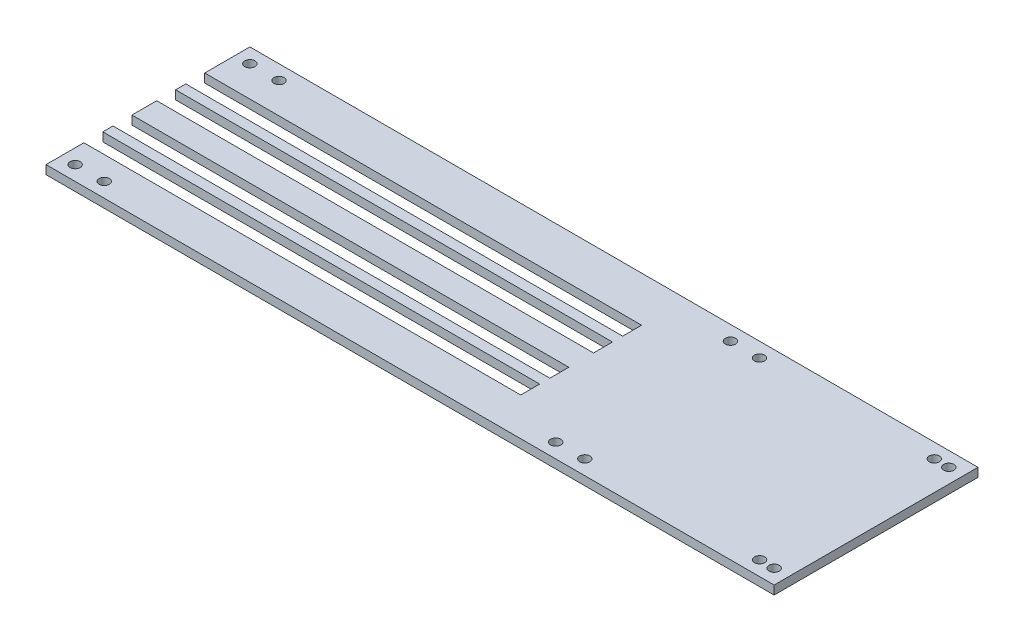
ISO-10303-21;
HEADER;
FILE_DESCRIPTION(('STEP AP214'),'2;1');
FILE_NAME('part.step','',(''),(''),'','','');
FILE_SCHEMA(('AUTOMOTIVE_DESIGN { 1 0 10303 214 1 1 1 1 }'));
ENDSEC;
DATA;
#1=APPLICATION_CONTEXT('core data for automotive mechanical design processes');
#2=APPLICATION_PROTOCOL_DEFINITION('international standard','automotive_design',2000,#1);
#3=PRODUCT_CONTEXT('',#1,'mechanical');
#4=PRODUCT('Part','Part','',(#3));
#5=PRODUCT_RELATED_PRODUCT_CATEGORY('part','',(#4));
#6=PRODUCT_DEFINITION_FORMATION('','',#4);
#7=PRODUCT_DEFINITION_CONTEXT('part definition',#1,'design');
#8=PRODUCT_DEFINITION('design','',#6,#7);
#9=PRODUCT_DEFINITION_SHAPE('','',#8);
#10=(LENGTH_UNIT() NAMED_UNIT(*) SI_UNIT(.MILLI.,.METRE.));
#11=(NAMED_UNIT(*) PLANE_ANGLE_UNIT() SI_UNIT($,.RADIAN.));
#12=(NAMED_UNIT(*) SI_UNIT($,.STERADIAN.) SOLID_ANGLE_UNIT());
#13=UNCERTAINTY_MEASURE_WITH_UNIT(LENGTH_MEASURE(1.E-05),#10,'distance_accuracy_value','');
#14=(GEOMETRIC_REPRESENTATION_CONTEXT(3) GLOBAL_UNCERTAINTY_ASSIGNED_CONTEXT((#13)) GLOBAL_UNIT_ASSIGNED_CONTEXT((#10,
#11,#12)) REPRESENTATION_CONTEXT('',''));
#15=CARTESIAN_POINT('',(0.,0.,0.));
#16=DIRECTION('',(0.,0.,1.));
#17=DIRECTION('',(1.,0.,0.));
#18=AXIS2_PLACEMENT_3D('',#15,#16,#17);
#19=CARTESIAN_POINT('',(0.,3.,0.));
#20=DIRECTION('',(0.,0.,-1.));
#21=DIRECTION('',(-1.,0.,0.));
#22=AXIS2_PLACEMENT_3D('',#19,#20,#21);
#23=PLANE('',#22);
#24=DIRECTION('',(1.,0.,0.));
#25=VECTOR('',#24,1.);
#26=CARTESIAN_POINT('',(0.,0.,0.));
#27=LINE('',#26,#25);
#28=CARTESIAN_POINT('',(-150.,0.,0.));
#29=VERTEX_POINT('',#28);
#30=CARTESIAN_POINT('',(100.,0.,0.));
#31=VERTEX_POINT('',#30);
#32=EDGE_CURVE('E141',#29,#31,#27,.T.);
#33=ORIENTED_EDGE('',*,*,#32,.T.);
#34=DIRECTION('',(0.,-1.,0.));
#35=VECTOR('',#34,1.);
#36=CARTESIAN_POINT('',(100.,3.,0.));
#37=LINE('',#36,#35);
#38=CARTESIAN_POINT('',(100.,3.,0.));
#39=VERTEX_POINT('',#38);
#40=EDGE_CURVE('E12',#39,#31,#37,.T.);
#41=ORIENTED_EDGE('',*,*,#40,.F.);
#42=DIRECTION('',(1.,0.,0.));
#43=VECTOR('',#42,1.);
#44=CARTESIAN_POINT('',(-150.,3.,0.));
#45=LINE('',#44,#43);
#46=CARTESIAN_POINT('',(-150.,3.,0.));
#47=VERTEX_POINT('',#46);
#48=EDGE_CURVE('E147',#47,#39,#45,.T.);
#49=ORIENTED_EDGE('',*,*,#48,.F.);
#50=DIRECTION('',(0.,-1.,0.));
#51=VECTOR('',#50,1.);
#52=CARTESIAN_POINT('',(-150.,3.,0.));
#53=LINE('',#52,#51);
#54=EDGE_CURVE('E221',#47,#29,#53,.T.);
#55=ORIENTED_EDGE('',*,*,#54,.T.);
#56=EDGE_LOOP('',(#33,#41,#49,#55));
#57=FACE_BOUND('',#56,.T.);
#58=ADVANCED_FACE('F50',(#57),#23,.F.);
#59=CARTESIAN_POINT('',(100.,3.,0.));
#60=DIRECTION('',(-1.,0.,0.));
#61=DIRECTION('',(0.,0.,1.));
#62=AXIS2_PLACEMENT_3D('',#59,#60,#61);
#63=PLANE('',#62);
#64=DIRECTION('',(0.,0.,-1.));
#65=VECTOR('',#64,1.);
#66=CARTESIAN_POINT('',(100.,0.,0.));
#67=LINE('',#66,#65);
#68=CARTESIAN_POINT('',(100.,0.,-70.));
#69=VERTEX_POINT('',#68);
#70=EDGE_CURVE('E482',#31,#69,#67,.T.);
#71=ORIENTED_EDGE('',*,*,#70,.T.);
#72=DIRECTION('',(0.,-1.,0.));
#73=VECTOR('',#72,1.);
#74=CARTESIAN_POINT('',(100.,3.,-70.));
#75=LINE('',#74,#73);
#76=CARTESIAN_POINT('',(100.,3.,-70.));
#77=VERTEX_POINT('',#76);
#78=EDGE_CURVE('E60',#77,#69,#75,.T.);
#79=ORIENTED_EDGE('',*,*,#78,.F.);
#80=DIRECTION('',(0.,0.,-1.));
#81=VECTOR('',#80,1.);
#82=CARTESIAN_POINT('',(100.,3.,0.));
#83=LINE('',#82,#81);
#84=EDGE_CURVE('E299',#39,#77,#83,.T.);
#85=ORIENTED_EDGE('',*,*,#84,.F.);
#86=ORIENTED_EDGE('',*,*,#40,.T.);
#87=EDGE_LOOP('',(#71,#79,#85,#86));
#88=FACE_BOUND('',#87,.T.);
#89=ADVANCED_FACE('F472',(#88),#63,.F.);
#90=CARTESIAN_POINT('',(-150.,3.,-70.));
#91=DIRECTION('',(0.,0.,1.));
#92=DIRECTION('',(1.,0.,0.));
#93=AXIS2_PLACEMENT_3D('',#90,#91,#92);
#94=PLANE('',#93);
#95=DIRECTION('',(-1.,0.,0.));
#96=VECTOR('',#95,1.);
#97=CARTESIAN_POINT('',(-150.,0.,-70.));
#98=LINE('',#97,#96);
#99=CARTESIAN_POINT('',(-150.,0.,-70.));
#100=VERTEX_POINT('',#99);
#101=EDGE_CURVE('E487',#69,#100,#98,.T.);
#102=ORIENTED_EDGE('',*,*,#101,.T.);
#103=DIRECTION('',(0.,-1.,0.));
#104=VECTOR('',#103,1.);
#105=CARTESIAN_POINT('',(-150.,3.,-70.));
#106=LINE('',#105,#104);
#107=CARTESIAN_POINT('',(-150.,3.,-70.));
#108=VERTEX_POINT('',#107);
#109=EDGE_CURVE('E599',#108,#100,#106,.T.);
#110=ORIENTED_EDGE('',*,*,#109,.F.);
#111=DIRECTION('',(-1.,0.,0.));
#112=VECTOR('',#111,1.);
#113=CARTESIAN_POINT('',(-50.,3.,-70.));
#114=LINE('',#113,#112);
#115=EDGE_CURVE('E295',#77,#108,#114,.T.);
#116=ORIENTED_EDGE('',*,*,#115,.F.);
#117=ORIENTED_EDGE('',*,*,#78,.T.);
#118=EDGE_LOOP('',(#102,#110,#116,#117));
#119=FACE_BOUND('',#118,.T.);
#120=ADVANCED_FACE('F477',(#119),#94,.F.);
#121=CARTESIAN_POINT('',(-150.,3.,-54.5));
#122=DIRECTION('',(1.,0.,0.));
#123=DIRECTION('',(0.,0.,-1.));
#124=AXIS2_PLACEMENT_3D('',#121,#122,#123);
#125=PLANE('',#124);
#126=DIRECTION('',(0.,0.,1.));
#127=VECTOR('',#126,1.);
#128=CARTESIAN_POINT('',(-150.,0.,-54.5));
#129=LINE('',#128,#127);
#130=CARTESIAN_POINT('',(-150.,0.,-54.5));
#131=VERTEX_POINT('',#130);
#132=EDGE_CURVE('E491',#100,#131,#129,.T.);
#133=ORIENTED_EDGE('',*,*,#132,.T.);
#134=DIRECTION('',(0.,-1.,0.));
#135=VECTOR('',#134,1.);
#136=CARTESIAN_POINT('',(-150.,3.,-54.5));
#137=LINE('',#136,#135);
#138=CARTESIAN_POINT('',(-150.,3.,-54.5));
#139=VERTEX_POINT('',#138);
#140=EDGE_CURVE('E595',#139,#131,#137,.T.);
#141=ORIENTED_EDGE('',*,*,#140,.F.);
#142=DIRECTION('',(0.,0.,1.));
#143=VECTOR('',#142,1.);
#144=CARTESIAN_POINT('',(-150.,3.,-54.5));
#145=LINE('',#144,#143);
#146=EDGE_CURVE('E291',#108,#139,#145,.T.);
#147=ORIENTED_EDGE('',*,*,#146,.F.);
#148=ORIENTED_EDGE('',*,*,#109,.T.);
#149=EDGE_LOOP('',(#133,#141,#147,#148));
#150=FACE_BOUND('',#149,.T.);
#151=ADVANCED_FACE('F689',(#150),#125,.F.);
#152=CARTESIAN_POINT('',(0.,3.,-54.5));
#153=DIRECTION('',(0.,0.,-1.));
#154=DIRECTION('',(-1.,0.,0.));
#155=AXIS2_PLACEMENT_3D('',#152,#153,#154);
#156=PLANE('',#155);
#157=DIRECTION('',(1.,0.,0.));
#158=VECTOR('',#157,1.);
#159=CARTESIAN_POINT('',(0.,0.,-54.5));
#160=LINE('',#159,#158);
#161=CARTESIAN_POINT('',(0.,0.,-54.5));
#162=VERTEX_POINT('',#161);
#163=EDGE_CURVE('E496',#131,#162,#160,.T.);
#164=ORIENTED_EDGE('',*,*,#163,.T.);
#165=DIRECTION('',(0.,-1.,0.));
#166=VECTOR('',#165,1.);
#167=CARTESIAN_POINT('',(0.,3.,-54.5));
#168=LINE('',#167,#166);
#169=CARTESIAN_POINT('',(0.,3.,-54.5));
#170=VERTEX_POINT('',#169);
#171=EDGE_CURVE('E591',#170,#162,#168,.T.);
#172=ORIENTED_EDGE('',*,*,#171,.F.);
#173=DIRECTION('',(1.,0.,0.));
#174=VECTOR('',#173,1.);
#175=CARTESIAN_POINT('',(0.,3.,-54.5));
#176=LINE('',#175,#174);
#177=EDGE_CURVE('E288',#139,#170,#176,.T.);
#178=ORIENTED_EDGE('',*,*,#177,.F.);
#179=ORIENTED_EDGE('',*,*,#140,.T.);
#180=EDGE_LOOP('',(#164,#172,#178,#179));
#181=FACE_BOUND('',#180,.T.);
#182=ADVANCED_FACE('F685',(#181),#156,.F.);
#183=CARTESIAN_POINT('',(0.,3.,-48.));
#184=DIRECTION('',(1.,0.,0.));
#185=DIRECTION('',(0.,0.,-1.));
#186=AXIS2_PLACEMENT_3D('',#183,#184,#185);
#187=PLANE('',#186);
#188=DIRECTION('',(0.,0.,1.));
#189=VECTOR('',#188,1.);
#190=CARTESIAN_POINT('',(0.,0.,-48.));
#191=LINE('',#190,#189);
#192=CARTESIAN_POINT('',(0.,0.,-48.));
#193=VERTEX_POINT('',#192);
#194=EDGE_CURVE('E499',#162,#193,#191,.T.);
#195=ORIENTED_EDGE('',*,*,#194,.T.);
#196=DIRECTION('',(0.,-1.,0.));
#197=VECTOR('',#196,1.);
#198=CARTESIAN_POINT('',(0.,3.,-48.));
#199=LINE('',#198,#197);
#200=CARTESIAN_POINT('',(0.,3.,-48.));
#201=VERTEX_POINT('',#200);
#202=EDGE_CURVE('E587',#201,#193,#199,.T.);
#203=ORIENTED_EDGE('',*,*,#202,.F.);
#204=DIRECTION('',(0.,0.,1.));
#205=VECTOR('',#204,1.);
#206=CARTESIAN_POINT('',(0.,3.,-48.));
#207=LINE('',#206,#205);
#208=EDGE_CURVE('E280',#170,#201,#207,.T.);
#209=ORIENTED_EDGE('',*,*,#208,.F.);
#210=ORIENTED_EDGE('',*,*,#171,.T.);
#211=EDGE_LOOP('',(#195,#203,#209,#210));
#212=FACE_BOUND('',#211,.T.);
#213=ADVANCED_FACE('F681',(#212),#187,.F.);
#214=CARTESIAN_POINT('',(-150.,3.,-48.));
#215=DIRECTION('',(0.,0.,1.));
#216=DIRECTION('',(1.,0.,0.));
#217=AXIS2_PLACEMENT_3D('',#214,#215,#216);
#218=PLANE('',#217);
#219=DIRECTION('',(-1.,0.,0.));
#220=VECTOR('',#219,1.);
#221=CARTESIAN_POINT('',(-150.,0.,-48.));
#222=LINE('',#221,#220);
#223=CARTESIAN_POINT('',(-150.,0.,-48.));
#224=VERTEX_POINT('',#223);
#225=EDGE_CURVE('E502',#193,#224,#222,.T.);
#226=ORIENTED_EDGE('',*,*,#225,.T.);
#227=DIRECTION('',(0.,-1.,0.));
#228=VECTOR('',#227,1.);
#229=CARTESIAN_POINT('',(-150.,3.,-48.));
#230=LINE('',#229,#228);
#231=CARTESIAN_POINT('',(-150.,3.,-48.));
#232=VERTEX_POINT('',#231);
#233=EDGE_CURVE('E583',#232,#224,#230,.T.);
#234=ORIENTED_EDGE('',*,*,#233,.F.);
#235=DIRECTION('',(-1.,0.,0.));
#236=VECTOR('',#235,1.);
#237=CARTESIAN_POINT('',(-150.,3.,-48.));
#238=LINE('',#237,#236);
#239=EDGE_CURVE('E276',#201,#232,#238,.T.);
#240=ORIENTED_EDGE('',*,*,#239,.F.);
#241=ORIENTED_EDGE('',*,*,#202,.T.);
#242=EDGE_LOOP('',(#226,#234,#240,#241));
#243=FACE_BOUND('',#242,.T.);
#244=ADVANCED_FACE('F677',(#243),#218,.F.);
#245=CARTESIAN_POINT('',(-150.,3.,-44.5));
#246=DIRECTION('',(1.,0.,0.));
#247=DIRECTION('',(0.,0.,-1.));
#248=AXIS2_PLACEMENT_3D('',#245,#246,#247);
#249=PLANE('',#248);
#250=DIRECTION('',(0.,0.,1.));
#251=VECTOR('',#250,1.);
#252=CARTESIAN_POINT('',(-150.,0.,-44.5));
#253=LINE('',#252,#251);
#254=CARTESIAN_POINT('',(-150.,0.,-44.5));
#255=VERTEX_POINT('',#254);
#256=EDGE_CURVE('E505',#224,#255,#253,.T.);
#257=ORIENTED_EDGE('',*,*,#256,.T.);
#258=DIRECTION('',(0.,-1.,0.));
#259=VECTOR('',#258,1.);
#260=CARTESIAN_POINT('',(-150.,3.,-44.5));
#261=LINE('',#260,#259);
#262=CARTESIAN_POINT('',(-150.,3.,-44.5));
#263=VERTEX_POINT('',#262);
#264=EDGE_CURVE('E579',#263,#255,#261,.T.);
#265=ORIENTED_EDGE('',*,*,#264,.F.);
#266=DIRECTION('',(0.,0.,1.));
#267=VECTOR('',#266,1.);
#268=CARTESIAN_POINT('',(-150.,3.,-44.5));
#269=LINE('',#268,#267);
#270=EDGE_CURVE('E272',#232,#263,#269,.T.);
#271=ORIENTED_EDGE('',*,*,#270,.F.);
#272=ORIENTED_EDGE('',*,*,#233,.T.);
#273=EDGE_LOOP('',(#257,#265,#271,#272));
#274=FACE_BOUND('',#273,.T.);
#275=ADVANCED_FACE('F673',(#274),#249,.F.);
#276=CARTESIAN_POINT('',(0.,3.,-44.5));
#277=DIRECTION('',(0.,0.,-1.));
#278=DIRECTION('',(-1.,0.,0.));
#279=AXIS2_PLACEMENT_3D('',#276,#277,#278);
#280=PLANE('',#279);
#281=DIRECTION('',(1.,0.,0.));
#282=VECTOR('',#281,1.);
#283=CARTESIAN_POINT('',(0.,0.,-44.5));
#284=LINE('',#283,#282);
#285=CARTESIAN_POINT('',(0.,0.,-44.5));
#286=VERTEX_POINT('',#285);
#287=EDGE_CURVE('E508',#255,#286,#284,.T.);
#288=ORIENTED_EDGE('',*,*,#287,.T.);
#289=DIRECTION('',(0.,-1.,0.));
#290=VECTOR('',#289,1.);
#291=CARTESIAN_POINT('',(0.,3.,-44.5));
#292=LINE('',#291,#290);
#293=CARTESIAN_POINT('',(0.,3.,-44.5));
#294=VERTEX_POINT('',#293);
#295=EDGE_CURVE('E575',#294,#286,#292,.T.);
#296=ORIENTED_EDGE('',*,*,#295,.F.);
#297=DIRECTION('',(1.,0.,0.));
#298=VECTOR('',#297,1.);
#299=CARTESIAN_POINT('',(0.,3.,-44.5));
#300=LINE('',#299,#298);
#301=EDGE_CURVE('E269',#263,#294,#300,.T.);
#302=ORIENTED_EDGE('',*,*,#301,.F.);
#303=ORIENTED_EDGE('',*,*,#264,.T.);
#304=EDGE_LOOP('',(#288,#296,#302,#303));
#305=FACE_BOUND('',#304,.T.);
#306=ADVANCED_FACE('F669',(#305),#280,.F.);
#307=CARTESIAN_POINT('',(0.,3.,-38.));
#308=DIRECTION('',(1.,0.,0.));
#309=DIRECTION('',(0.,0.,-1.));
#310=AXIS2_PLACEMENT_3D('',#307,#308,#309);
#311=PLANE('',#310);
#312=DIRECTION('',(0.,0.,1.));
#313=VECTOR('',#312,1.);
#314=CARTESIAN_POINT('',(0.,0.,-38.));
#315=LINE('',#314,#313);
#316=CARTESIAN_POINT('',(0.,0.,-38.));
#317=VERTEX_POINT('',#316);
#318=EDGE_CURVE('E511',#286,#317,#315,.T.);
#319=ORIENTED_EDGE('',*,*,#318,.T.);
#320=DIRECTION('',(0.,-1.,0.));
#321=VECTOR('',#320,1.);
#322=CARTESIAN_POINT('',(0.,3.,-38.));
#323=LINE('',#322,#321);
#324=CARTESIAN_POINT('',(0.,3.,-38.));
#325=VERTEX_POINT('',#324);
#326=EDGE_CURVE('E571',#325,#317,#323,.T.);
#327=ORIENTED_EDGE('',*,*,#326,.F.);
#328=DIRECTION('',(0.,0.,1.));
#329=VECTOR('',#328,1.);
#330=CARTESIAN_POINT('',(0.,3.,-38.));
#331=LINE('',#330,#329);
#332=EDGE_CURVE('E261',#294,#325,#331,.T.);
#333=ORIENTED_EDGE('',*,*,#332,.F.);
#334=ORIENTED_EDGE('',*,*,#295,.T.);
#335=EDGE_LOOP('',(#319,#327,#333,#334));
#336=FACE_BOUND('',#335,.T.);
#337=ADVANCED_FACE('F665',(#336),#311,.F.);
#338=CARTESIAN_POINT('',(-150.,3.,-38.));
#339=DIRECTION('',(0.,0.,1.));
#340=DIRECTION('',(1.,0.,0.));
#341=AXIS2_PLACEMENT_3D('',#338,#339,#340);
#342=PLANE('',#341);
#343=DIRECTION('',(-1.,0.,0.));
#344=VECTOR('',#343,1.);
#345=CARTESIAN_POINT('',(-150.,0.,-38.));
#346=LINE('',#345,#344);
#347=CARTESIAN_POINT('',(-150.,0.,-38.));
#348=VERTEX_POINT('',#347);
#349=EDGE_CURVE('E514',#317,#348,#346,.T.);
#350=ORIENTED_EDGE('',*,*,#349,.T.);
#351=DIRECTION('',(0.,-1.,0.));
#352=VECTOR('',#351,1.);
#353=CARTESIAN_POINT('',(-150.,3.,-38.));
#354=LINE('',#353,#352);
#355=CARTESIAN_POINT('',(-150.,3.,-38.));
#356=VERTEX_POINT('',#355);
#357=EDGE_CURVE('E567',#356,#348,#354,.T.);
#358=ORIENTED_EDGE('',*,*,#357,.F.);
#359=DIRECTION('',(-1.,0.,0.));
#360=VECTOR('',#359,1.);
#361=CARTESIAN_POINT('',(-150.,3.,-38.));
#362=LINE('',#361,#360);
#363=EDGE_CURVE('E257',#325,#356,#362,.T.);
#364=ORIENTED_EDGE('',*,*,#363,.F.);
#365=ORIENTED_EDGE('',*,*,#326,.T.);
#366=EDGE_LOOP('',(#350,#358,#364,#365));
#367=FACE_BOUND('',#366,.T.);
#368=ADVANCED_FACE('F661',(#367),#342,.F.);
#369=CARTESIAN_POINT('',(-150.,3.,-29.5));
#370=DIRECTION('',(1.,0.,0.));
#371=DIRECTION('',(0.,0.,-1.));
#372=AXIS2_PLACEMENT_3D('',#369,#370,#371);
#373=PLANE('',#372);
#374=DIRECTION('',(0.,0.,1.));
#375=VECTOR('',#374,1.);
#376=CARTESIAN_POINT('',(-150.,0.,-29.5));
#377=LINE('',#376,#375);
#378=CARTESIAN_POINT('',(-150.,0.,-29.5));
#379=VERTEX_POINT('',#378);
#380=EDGE_CURVE('E517',#348,#379,#377,.T.);
#381=ORIENTED_EDGE('',*,*,#380,.T.);
#382=DIRECTION('',(0.,-1.,0.));
#383=VECTOR('',#382,1.);
#384=CARTESIAN_POINT('',(-150.,3.,-29.5));
#385=LINE('',#384,#383);
#386=CARTESIAN_POINT('',(-150.,3.,-29.5));
#387=VERTEX_POINT('',#386);
#388=EDGE_CURVE('E563',#387,#379,#385,.T.);
#389=ORIENTED_EDGE('',*,*,#388,.F.);
#390=DIRECTION('',(0.,0.,1.));
#391=VECTOR('',#390,1.);
#392=CARTESIAN_POINT('',(-150.,3.,-29.5));
#393=LINE('',#392,#391);
#394=EDGE_CURVE('E253',#356,#387,#393,.T.);
#395=ORIENTED_EDGE('',*,*,#394,.F.);
#396=ORIENTED_EDGE('',*,*,#357,.T.);
#397=EDGE_LOOP('',(#381,#389,#395,#396));
#398=FACE_BOUND('',#397,.T.);
#399=ADVANCED_FACE('F657',(#398),#373,.F.);
#400=CARTESIAN_POINT('',(-150.,3.,-29.5));
#401=DIRECTION('',(0.,0.,-1.));
#402=DIRECTION('',(-1.,0.,0.));
#403=AXIS2_PLACEMENT_3D('',#400,#401,#402);
#404=PLANE('',#403);
#405=DIRECTION('',(1.,0.,0.));
#406=VECTOR('',#405,1.);
#407=CARTESIAN_POINT('',(-150.,0.,-29.5));
#408=LINE('',#407,#406);
#409=CARTESIAN_POINT('',(0.,0.,-29.5));
#410=VERTEX_POINT('',#409);
#411=EDGE_CURVE('E520',#379,#410,#408,.T.);
#412=ORIENTED_EDGE('',*,*,#411,.T.);
#413=DIRECTION('',(0.,-1.,0.));
#414=VECTOR('',#413,1.);
#415=CARTESIAN_POINT('',(0.,3.,-29.5));
#416=LINE('',#415,#414);
#417=CARTESIAN_POINT('',(0.,3.,-29.5));
#418=VERTEX_POINT('',#417);
#419=EDGE_CURVE('E559',#418,#410,#416,.T.);
#420=ORIENTED_EDGE('',*,*,#419,.F.);
#421=DIRECTION('',(1.,0.,0.));
#422=VECTOR('',#421,1.);
#423=CARTESIAN_POINT('',(-150.,3.,-29.5));
#424=LINE('',#423,#422);
#425=EDGE_CURVE('E250',#387,#418,#424,.T.);
#426=ORIENTED_EDGE('',*,*,#425,.F.);
#427=ORIENTED_EDGE('',*,*,#388,.T.);
#428=EDGE_LOOP('',(#412,#420,#426,#427));
#429=FACE_BOUND('',#428,.T.);
#430=ADVANCED_FACE('F654',(#429),#404,.F.);
#431=CARTESIAN_POINT('',(0.,3.,-29.5));
#432=DIRECTION('',(1.,0.,0.));
#433=DIRECTION('',(0.,0.,-1.));
#434=AXIS2_PLACEMENT_3D('',#431,#432,#433);
#435=PLANE('',#434);
#436=DIRECTION('',(0.,0.,1.));
#437=VECTOR('',#436,1.);
#438=CARTESIAN_POINT('',(0.,0.,-29.5));
#439=LINE('',#438,#437);
#440=CARTESIAN_POINT('',(0.,0.,-23.));
#441=VERTEX_POINT('',#440);
#442=EDGE_CURVE('E523',#410,#441,#439,.T.);
#443=ORIENTED_EDGE('',*,*,#442,.T.);
#444=DIRECTION('',(0.,-1.,0.));
#445=VECTOR('',#444,1.);
#446=CARTESIAN_POINT('',(0.,3.,-23.));
#447=LINE('',#446,#445);
#448=CARTESIAN_POINT('',(0.,3.,-23.));
#449=VERTEX_POINT('',#448);
#450=EDGE_CURVE('E555',#449,#441,#447,.T.);
#451=ORIENTED_EDGE('',*,*,#450,.F.);
#452=DIRECTION('',(0.,0.,1.));
#453=VECTOR('',#452,1.);
#454=CARTESIAN_POINT('',(0.,3.,-29.5));
#455=LINE('',#454,#453);
#456=EDGE_CURVE('E242',#418,#449,#455,.T.);
#457=ORIENTED_EDGE('',*,*,#456,.F.);
#458=ORIENTED_EDGE('',*,*,#419,.T.);
#459=EDGE_LOOP('',(#443,#451,#457,#458));
#460=FACE_BOUND('',#459,.T.);
#461=ADVANCED_FACE('F619',(#460),#435,.F.);
#462=CARTESIAN_POINT('',(0.,3.,-23.));
#463=DIRECTION('',(0.,0.,1.));
#464=DIRECTION('',(1.,0.,0.));
#465=AXIS2_PLACEMENT_3D('',#462,#463,#464);
#466=PLANE('',#465);
#467=DIRECTION('',(-1.,0.,0.));
#468=VECTOR('',#467,1.);
#469=CARTESIAN_POINT('',(0.,0.,-23.));
#470=LINE('',#469,#468);
#471=CARTESIAN_POINT('',(-150.,0.,-23.));
#472=VERTEX_POINT('',#471);
#473=EDGE_CURVE('E526',#441,#472,#470,.T.);
#474=ORIENTED_EDGE('',*,*,#473,.T.);
#475=DIRECTION('',(0.,-1.,0.));
#476=VECTOR('',#475,1.);
#477=CARTESIAN_POINT('',(-150.,3.,-23.));
#478=LINE('',#477,#476);
#479=CARTESIAN_POINT('',(-150.,3.,-23.));
#480=VERTEX_POINT('',#479);
#481=EDGE_CURVE('E551',#480,#472,#478,.T.);
#482=ORIENTED_EDGE('',*,*,#481,.F.);
#483=DIRECTION('',(-1.,0.,0.));
#484=VECTOR('',#483,1.);
#485=CARTESIAN_POINT('',(0.,3.,-23.));
#486=LINE('',#485,#484);
#487=EDGE_CURVE('E238',#449,#480,#486,.T.);
#488=ORIENTED_EDGE('',*,*,#487,.F.);
#489=ORIENTED_EDGE('',*,*,#450,.T.);
#490=EDGE_LOOP('',(#474,#482,#488,#489));
#491=FACE_BOUND('',#490,.T.);
#492=ADVANCED_FACE('F623',(#491),#466,.F.);
#493=CARTESIAN_POINT('',(-150.,3.,-23.));
#494=DIRECTION('',(1.,0.,0.));
#495=DIRECTION('',(0.,0.,-1.));
#496=AXIS2_PLACEMENT_3D('',#493,#494,#495);
#497=PLANE('',#496);
#498=DIRECTION('',(0.,0.,1.));
#499=VECTOR('',#498,1.);
#500=CARTESIAN_POINT('',(-150.,0.,-23.));
#501=LINE('',#500,#499);
#502=CARTESIAN_POINT('',(-150.,0.,-19.5));
#503=VERTEX_POINT('',#502);
#504=EDGE_CURVE('E529',#472,#503,#501,.T.);
#505=ORIENTED_EDGE('',*,*,#504,.T.);
#506=DIRECTION('',(0.,-1.,0.));
#507=VECTOR('',#506,1.);
#508=CARTESIAN_POINT('',(-150.,3.,-19.5));
#509=LINE('',#508,#507);
#510=CARTESIAN_POINT('',(-150.,3.,-19.5));
#511=VERTEX_POINT('',#510);
#512=EDGE_CURVE('E547',#511,#503,#509,.T.);
#513=ORIENTED_EDGE('',*,*,#512,.F.);
#514=DIRECTION('',(0.,0.,1.));
#515=VECTOR('',#514,1.);
#516=CARTESIAN_POINT('',(-150.,3.,-23.));
#517=LINE('',#516,#515);
#518=EDGE_CURVE('E234',#480,#511,#517,.T.);
#519=ORIENTED_EDGE('',*,*,#518,.F.);
#520=ORIENTED_EDGE('',*,*,#481,.T.);
#521=EDGE_LOOP('',(#505,#513,#519,#520));
#522=FACE_BOUND('',#521,.T.);
#523=ADVANCED_FACE('F628',(#522),#497,.F.);
#524=CARTESIAN_POINT('',(-150.,3.,-19.5));
#525=DIRECTION('',(0.,0.,-1.));
#526=DIRECTION('',(-1.,0.,0.));
#527=AXIS2_PLACEMENT_3D('',#524,#525,#526);
#528=PLANE('',#527);
#529=DIRECTION('',(1.,0.,0.));
#530=VECTOR('',#529,1.);
#531=CARTESIAN_POINT('',(-150.,0.,-19.5));
#532=LINE('',#531,#530);
#533=CARTESIAN_POINT('',(0.,0.,-19.5));
#534=VERTEX_POINT('',#533);
#535=EDGE_CURVE('E532',#503,#534,#532,.T.);
#536=ORIENTED_EDGE('',*,*,#535,.T.);
#537=DIRECTION('',(0.,-1.,0.));
#538=VECTOR('',#537,1.);
#539=CARTESIAN_POINT('',(0.,3.,-19.5));
#540=LINE('',#539,#538);
#541=CARTESIAN_POINT('',(0.,3.,-19.5));
#542=VERTEX_POINT('',#541);
#543=EDGE_CURVE('E214',#542,#534,#540,.T.);
#544=ORIENTED_EDGE('',*,*,#543,.F.);
#545=DIRECTION('',(1.,0.,0.));
#546=VECTOR('',#545,1.);
#547=CARTESIAN_POINT('',(-150.,3.,-19.5));
#548=LINE('',#547,#546);
#549=EDGE_CURVE('E203',#511,#542,#548,.T.);
#550=ORIENTED_EDGE('',*,*,#549,.F.);
#551=ORIENTED_EDGE('',*,*,#512,.T.);
#552=EDGE_LOOP('',(#536,#544,#550,#551));
#553=FACE_BOUND('',#552,.T.);
#554=ADVANCED_FACE('F631',(#553),#528,.F.);
#555=CARTESIAN_POINT('',(0.,3.,-19.5));
#556=DIRECTION('',(1.,0.,0.));
#557=DIRECTION('',(0.,0.,-1.));
#558=AXIS2_PLACEMENT_3D('',#555,#556,#557);
#559=PLANE('',#558);
#560=DIRECTION('',(0.,0.,1.));
#561=VECTOR('',#560,1.);
#562=CARTESIAN_POINT('',(0.,0.,-19.5));
#563=LINE('',#562,#561);
#564=CARTESIAN_POINT('',(0.,0.,-13.));
#565=VERTEX_POINT('',#564);
#566=EDGE_CURVE('E212',#534,#565,#563,.T.);
#567=ORIENTED_EDGE('',*,*,#566,.T.);
#568=DIRECTION('',(0.,-1.,0.));
#569=VECTOR('',#568,1.);
#570=CARTESIAN_POINT('',(0.,3.,-13.));
#571=LINE('',#570,#569);
#572=CARTESIAN_POINT('',(0.,3.,-13.));
#573=VERTEX_POINT('',#572);
#574=EDGE_CURVE('E209',#573,#565,#571,.T.);
#575=ORIENTED_EDGE('',*,*,#574,.F.);
#576=DIRECTION('',(0.,0.,1.));
#577=VECTOR('',#576,1.);
#578=CARTESIAN_POINT('',(0.,3.,-19.5));
#579=LINE('',#578,#577);
#580=EDGE_CURVE('E197',#542,#573,#579,.T.);
#581=ORIENTED_EDGE('',*,*,#580,.F.);
#582=ORIENTED_EDGE('',*,*,#543,.T.);
#583=EDGE_LOOP('',(#567,#575,#581,#582));
#584=FACE_BOUND('',#583,.T.);
#585=ADVANCED_FACE('F210',(#584),#559,.F.);
#586=CARTESIAN_POINT('',(0.,3.,-13.));
#587=DIRECTION('',(0.,0.,1.));
#588=DIRECTION('',(1.,0.,0.));
#589=AXIS2_PLACEMENT_3D('',#586,#587,#588);
#590=PLANE('',#589);
#591=DIRECTION('',(-1.,0.,0.));
#592=VECTOR('',#591,1.);
#593=CARTESIAN_POINT('',(0.,0.,-13.));
#594=LINE('',#593,#592);
#595=CARTESIAN_POINT('',(-150.,0.,-13.));
#596=VERTEX_POINT('',#595);
#597=EDGE_CURVE('E134',#565,#596,#594,.T.);
#598=ORIENTED_EDGE('',*,*,#597,.T.);
#599=DIRECTION('',(0.,-1.,0.));
#600=VECTOR('',#599,1.);
#601=CARTESIAN_POINT('',(-150.,3.,-13.));
#602=LINE('',#601,#600);
#603=CARTESIAN_POINT('',(-150.,3.,-13.));
#604=VERTEX_POINT('',#603);
#605=EDGE_CURVE('E215',#604,#596,#602,.T.);
#606=ORIENTED_EDGE('',*,*,#605,.F.);
#607=DIRECTION('',(-1.,0.,0.));
#608=VECTOR('',#607,1.);
#609=CARTESIAN_POINT('',(0.,3.,-13.));
#610=LINE('',#609,#608);
#611=EDGE_CURVE('E201',#573,#604,#610,.T.);
#612=ORIENTED_EDGE('',*,*,#611,.F.);
#613=ORIENTED_EDGE('',*,*,#574,.T.);
#614=EDGE_LOOP('',(#598,#606,#612,#613));
#615=FACE_BOUND('',#614,.T.);
#616=ADVANCED_FACE('F217',(#615),#590,.F.);
#617=CARTESIAN_POINT('',(-150.,3.,-13.));
#618=DIRECTION('',(1.,0.,0.));
#619=DIRECTION('',(0.,0.,-1.));
#620=AXIS2_PLACEMENT_3D('',#617,#618,#619);
#621=PLANE('',#620);
#622=DIRECTION('',(0.,0.,1.));
#623=VECTOR('',#622,1.);
#624=CARTESIAN_POINT('',(-150.,0.,-13.));
#625=LINE('',#624,#623);
#626=EDGE_CURVE('E309',#596,#29,#625,.T.);
#627=ORIENTED_EDGE('',*,*,#626,.T.);
#628=ORIENTED_EDGE('',*,*,#54,.F.);
#629=DIRECTION('',(0.,0.,1.));
#630=VECTOR('',#629,1.);
#631=CARTESIAN_POINT('',(-150.,3.,-13.));
#632=LINE('',#631,#630);
#633=EDGE_CURVE('E69',#604,#47,#632,.T.);
#634=ORIENTED_EDGE('',*,*,#633,.F.);
#635=ORIENTED_EDGE('',*,*,#605,.T.);
#636=EDGE_LOOP('',(#627,#628,#634,#635));
#637=FACE_BOUND('',#636,.T.);
#638=ADVANCED_FACE('F633',(#637),#621,.F.);
#639=CARTESIAN_POINT('',(0.,3.,0.));
#640=DIRECTION('',(0.,1.,0.));
#641=DIRECTION('',(0.,0.,1.));
#642=AXIS2_PLACEMENT_3D('',#639,#640,#641);
#643=PLANE('',#642);
#644=CARTESIAN_POINT('',(95.,3.,-5.));
#645=DIRECTION('',(0.,-1.,0.));
#646=DIRECTION('',(0.,0.,-1.));
#647=AXIS2_PLACEMENT_3D('',#644,#645,#646);
#648=CIRCLE('',#647,1.75);
#649=CARTESIAN_POINT('',(95.,3.,-6.75));
#650=VERTEX_POINT('',#649);
#651=EDGE_CURVE('E374',#650,#650,#648,.T.);
#652=ORIENTED_EDGE('',*,*,#651,.T.);
#653=EDGE_LOOP('',(#652));
#654=FACE_BOUND('',#653,.T.);
#655=CARTESIAN_POINT('',(90.,3.,-5.));
#656=DIRECTION('',(0.,-1.,0.));
#657=DIRECTION('',(0.,0.,-1.));
#658=AXIS2_PLACEMENT_3D('',#655,#656,#657);
#659=CIRCLE('',#658,1.75);
#660=CARTESIAN_POINT('',(90.,3.,-6.75));
#661=VERTEX_POINT('',#660);
#662=EDGE_CURVE('E369',#661,#661,#659,.T.);
#663=ORIENTED_EDGE('',*,*,#662,.T.);
#664=EDGE_LOOP('',(#663));
#665=FACE_BOUND('',#664,.T.);
#666=CARTESIAN_POINT('',(-145.,3.,-5.));
#667=DIRECTION('',(0.,-1.,0.));
#668=DIRECTION('',(0.,0.,-1.));
#669=AXIS2_PLACEMENT_3D('',#666,#667,#668);
#670=CIRCLE('',#669,1.75000000000001);
#671=CARTESIAN_POINT('',(-145.,3.,-6.75000000000002));
#672=VERTEX_POINT('',#671);
#673=EDGE_CURVE('E363',#672,#672,#670,.T.);
#674=ORIENTED_EDGE('',*,*,#673,.T.);
#675=EDGE_LOOP('',(#674));
#676=FACE_BOUND('',#675,.T.);
#677=CARTESIAN_POINT('',(-135.,3.,-5.));
#678=DIRECTION('',(0.,-1.,0.));
#679=DIRECTION('',(0.,0.,-1.));
#680=AXIS2_PLACEMENT_3D('',#677,#678,#679);
#681=CIRCLE('',#680,1.75000000000001);
#682=CARTESIAN_POINT('',(-135.,3.,-6.75000000000002));
#683=VERTEX_POINT('',#682);
#684=EDGE_CURVE('E358',#683,#683,#681,.T.);
#685=ORIENTED_EDGE('',*,*,#684,.T.);
#686=EDGE_LOOP('',(#685));
#687=FACE_BOUND('',#686,.T.);
#688=CARTESIAN_POINT('',(20.,3.,-5.));
#689=DIRECTION('',(0.,-1.,0.));
#690=DIRECTION('',(0.,0.,-1.));
#691=AXIS2_PLACEMENT_3D('',#688,#689,#690);
#692=CIRCLE('',#691,1.75);
#693=CARTESIAN_POINT('',(20.,3.,-6.75000000000001));
#694=VERTEX_POINT('',#693);
#695=EDGE_CURVE('E354',#694,#694,#692,.T.);
#696=ORIENTED_EDGE('',*,*,#695,.T.);
#697=EDGE_LOOP('',(#696));
#698=FACE_BOUND('',#697,.T.);
#699=CARTESIAN_POINT('',(30.,3.,-5.));
#700=DIRECTION('',(0.,-1.,0.));
#701=DIRECTION('',(0.,0.,-1.));
#702=AXIS2_PLACEMENT_3D('',#699,#700,#701);
#703=CIRCLE('',#702,1.75);
#704=CARTESIAN_POINT('',(30.,3.,-6.75000000000001));
#705=VERTEX_POINT('',#704);
#706=EDGE_CURVE('E346',#705,#705,#703,.T.);
#707=ORIENTED_EDGE('',*,*,#706,.T.);
#708=EDGE_LOOP('',(#707));
#709=FACE_BOUND('',#708,.T.);
#710=CARTESIAN_POINT('',(95.,3.,-65.));
#711=DIRECTION('',(0.,1.,0.));
#712=DIRECTION('',(0.,0.,1.));
#713=AXIS2_PLACEMENT_3D('',#710,#711,#712);
#714=CIRCLE('',#713,1.75);
#715=CARTESIAN_POINT('',(95.,3.,-63.25));
#716=VERTEX_POINT('',#715);
#717=EDGE_CURVE('E339',#716,#716,#714,.T.);
#718=ORIENTED_EDGE('',*,*,#717,.F.);
#719=EDGE_LOOP('',(#718));
#720=FACE_BOUND('',#719,.T.);
#721=CARTESIAN_POINT('',(90.,3.,-65.));
#722=DIRECTION('',(0.,1.,0.));
#723=DIRECTION('',(0.,0.,1.));
#724=AXIS2_PLACEMENT_3D('',#721,#722,#723);
#725=CIRCLE('',#724,1.75);
#726=CARTESIAN_POINT('',(90.,3.,-63.25));
#727=VERTEX_POINT('',#726);
#728=EDGE_CURVE('E334',#727,#727,#725,.T.);
#729=ORIENTED_EDGE('',*,*,#728,.F.);
#730=EDGE_LOOP('',(#729));
#731=FACE_BOUND('',#730,.T.);
#732=CARTESIAN_POINT('',(-145.,3.,-65.));
#733=DIRECTION('',(0.,1.,0.));
#734=DIRECTION('',(0.,0.,1.));
#735=AXIS2_PLACEMENT_3D('',#732,#733,#734);
#736=CIRCLE('',#735,1.75000000000001);
#737=CARTESIAN_POINT('',(-145.,3.,-63.25));
#738=VERTEX_POINT('',#737);
#739=EDGE_CURVE('E329',#738,#738,#736,.T.);
#740=ORIENTED_EDGE('',*,*,#739,.F.);
#741=EDGE_LOOP('',(#740));
#742=FACE_BOUND('',#741,.T.);
#743=CARTESIAN_POINT('',(-135.,3.,-65.));
#744=DIRECTION('',(0.,1.,0.));
#745=DIRECTION('',(0.,0.,1.));
#746=AXIS2_PLACEMENT_3D('',#743,#744,#745);
#747=CIRCLE('',#746,1.75000000000001);
#748=CARTESIAN_POINT('',(-135.,3.,-63.25));
#749=VERTEX_POINT('',#748);
#750=EDGE_CURVE('E321',#749,#749,#747,.T.);
#751=ORIENTED_EDGE('',*,*,#750,.F.);
#752=EDGE_LOOP('',(#751));
#753=FACE_BOUND('',#752,.T.);
#754=CARTESIAN_POINT('',(20.,3.,-65.));
#755=DIRECTION('',(0.,1.,0.));
#756=DIRECTION('',(0.,0.,1.));
#757=AXIS2_PLACEMENT_3D('',#754,#755,#756);
#758=CIRCLE('',#757,1.75);
#759=CARTESIAN_POINT('',(20.,3.,-63.25));
#760=VERTEX_POINT('',#759);
#761=EDGE_CURVE('E315',#760,#760,#758,.T.);
#762=ORIENTED_EDGE('',*,*,#761,.F.);
#763=EDGE_LOOP('',(#762));
#764=FACE_BOUND('',#763,.T.);
#765=CARTESIAN_POINT('',(30.,3.,-65.));
#766=DIRECTION('',(0.,1.,0.));
#767=DIRECTION('',(0.,0.,1.));
#768=AXIS2_PLACEMENT_3D('',#765,#766,#767);
#769=CIRCLE('',#768,1.75);
#770=CARTESIAN_POINT('',(30.,3.,-63.25));
#771=VERTEX_POINT('',#770);
#772=EDGE_CURVE('E310',#771,#771,#769,.T.);
#773=ORIENTED_EDGE('',*,*,#772,.F.);
#774=EDGE_LOOP('',(#773));
#775=FACE_BOUND('',#774,.T.);
#776=ORIENTED_EDGE('',*,*,#48,.T.);
#777=ORIENTED_EDGE('',*,*,#84,.T.);
#778=ORIENTED_EDGE('',*,*,#115,.T.);
#779=ORIENTED_EDGE('',*,*,#146,.T.);
#780=ORIENTED_EDGE('',*,*,#177,.T.);
#781=ORIENTED_EDGE('',*,*,#208,.T.);
#782=ORIENTED_EDGE('',*,*,#239,.T.);
#783=ORIENTED_EDGE('',*,*,#270,.T.);
#784=ORIENTED_EDGE('',*,*,#301,.T.);
#785=ORIENTED_EDGE('',*,*,#332,.T.);
#786=ORIENTED_EDGE('',*,*,#363,.T.);
#787=ORIENTED_EDGE('',*,*,#394,.T.);
#788=ORIENTED_EDGE('',*,*,#425,.T.);
#789=ORIENTED_EDGE('',*,*,#456,.T.);
#790=ORIENTED_EDGE('',*,*,#487,.T.);
#791=ORIENTED_EDGE('',*,*,#518,.T.);
#792=ORIENTED_EDGE('',*,*,#549,.T.);
#793=ORIENTED_EDGE('',*,*,#580,.T.);
#794=ORIENTED_EDGE('',*,*,#611,.T.);
#795=ORIENTED_EDGE('',*,*,#633,.T.);
#796=EDGE_LOOP('',(#776,#777,#778,#779,#780,#781,#782,#783,#784,#785,#786,#787,#788,#789,#790,
#791,#792,#793,#794,#795));
#797=FACE_BOUND('',#796,.T.);
#798=ADVANCED_FACE('F199',(#654,#665,#676,#687,#698,#709,#720,#731,#742,#753,#764,#775,#797),
#643,.T.);
#799=CARTESIAN_POINT('',(0.,0.,0.));
#800=DIRECTION('',(0.,1.,0.));
#801=DIRECTION('',(0.,0.,1.));
#802=AXIS2_PLACEMENT_3D('',#799,#800,#801);
#803=PLANE('',#802);
#804=CARTESIAN_POINT('',(95.,0.,-5.));
#805=DIRECTION('',(0.,1.,0.));
#806=DIRECTION('',(0.,0.,1.));
#807=AXIS2_PLACEMENT_3D('',#804,#805,#806);
#808=CIRCLE('',#807,1.75);
#809=CARTESIAN_POINT('',(95.,0.,-3.25000000000001));
#810=VERTEX_POINT('',#809);
#811=EDGE_CURVE('E53',#810,#810,#808,.F.);
#812=ORIENTED_EDGE('',*,*,#811,.F.);
#813=EDGE_LOOP('',(#812));
#814=FACE_BOUND('',#813,.T.);
#815=CARTESIAN_POINT('',(90.,0.,-5.));
#816=DIRECTION('',(0.,1.,0.));
#817=DIRECTION('',(0.,0.,1.));
#818=AXIS2_PLACEMENT_3D('',#815,#816,#817);
#819=CIRCLE('',#818,1.75);
#820=CARTESIAN_POINT('',(90.,0.,-3.25000000000001));
#821=VERTEX_POINT('',#820);
#822=EDGE_CURVE('E378',#821,#821,#819,.F.);
#823=ORIENTED_EDGE('',*,*,#822,.F.);
#824=EDGE_LOOP('',(#823));
#825=FACE_BOUND('',#824,.T.);
#826=CARTESIAN_POINT('',(-145.,0.,-5.));
#827=DIRECTION('',(0.,1.,0.));
#828=DIRECTION('',(0.,0.,1.));
#829=AXIS2_PLACEMENT_3D('',#826,#827,#828);
#830=CIRCLE('',#829,1.75000000000001);
#831=CARTESIAN_POINT('',(-145.,0.,-3.24999999999999));
#832=VERTEX_POINT('',#831);
#833=EDGE_CURVE('E340',#832,#832,#830,.F.);
#834=ORIENTED_EDGE('',*,*,#833,.F.);
#835=EDGE_LOOP('',(#834));
#836=FACE_BOUND('',#835,.T.);
#837=CARTESIAN_POINT('',(-135.,0.,-5.));
#838=DIRECTION('',(0.,1.,0.));
#839=DIRECTION('',(0.,0.,1.));
#840=AXIS2_PLACEMENT_3D('',#837,#838,#839);
#841=CIRCLE('',#840,1.75000000000001);
#842=CARTESIAN_POINT('',(-135.,0.,-3.24999999999999));
#843=VERTEX_POINT('',#842);
#844=EDGE_CURVE('E409',#843,#843,#841,.F.);
#845=ORIENTED_EDGE('',*,*,#844,.F.);
#846=EDGE_LOOP('',(#845));
#847=FACE_BOUND('',#846,.T.);
#848=CARTESIAN_POINT('',(20.,0.,-5.));
#849=DIRECTION('',(0.,1.,0.));
#850=DIRECTION('',(0.,0.,1.));
#851=AXIS2_PLACEMENT_3D('',#848,#849,#850);
#852=CIRCLE('',#851,1.75);
#853=CARTESIAN_POINT('',(20.,0.,-3.25));
#854=VERTEX_POINT('',#853);
#855=EDGE_CURVE('E413',#854,#854,#852,.F.);
#856=ORIENTED_EDGE('',*,*,#855,.F.);
#857=EDGE_LOOP('',(#856));
#858=FACE_BOUND('',#857,.T.);
#859=CARTESIAN_POINT('',(30.,0.,-5.));
#860=DIRECTION('',(0.,1.,0.));
#861=DIRECTION('',(0.,0.,1.));
#862=AXIS2_PLACEMENT_3D('',#859,#860,#861);
#863=CIRCLE('',#862,1.75);
#864=CARTESIAN_POINT('',(30.,0.,-3.25));
#865=VERTEX_POINT('',#864);
#866=EDGE_CURVE('E368',#865,#865,#863,.F.);
#867=ORIENTED_EDGE('',*,*,#866,.F.);
#868=EDGE_LOOP('',(#867));
#869=FACE_BOUND('',#868,.T.);
#870=CARTESIAN_POINT('',(95.,0.,-65.));
#871=DIRECTION('',(0.,1.,0.));
#872=DIRECTION('',(0.,0.,1.));
#873=AXIS2_PLACEMENT_3D('',#870,#871,#872);
#874=CIRCLE('',#873,1.75);
#875=CARTESIAN_POINT('',(95.,0.,-63.25));
#876=VERTEX_POINT('',#875);
#877=EDGE_CURVE('E316',#876,#876,#874,.T.);
#878=ORIENTED_EDGE('',*,*,#877,.T.);
#879=EDGE_LOOP('',(#878));
#880=FACE_BOUND('',#879,.T.);
#881=CARTESIAN_POINT('',(90.,0.,-65.));
#882=DIRECTION('',(0.,1.,0.));
#883=DIRECTION('',(0.,0.,1.));
#884=AXIS2_PLACEMENT_3D('',#881,#882,#883);
#885=CIRCLE('',#884,1.75);
#886=CARTESIAN_POINT('',(90.,0.,-63.25));
#887=VERTEX_POINT('',#886);
#888=EDGE_CURVE('E345',#887,#887,#885,.T.);
#889=ORIENTED_EDGE('',*,*,#888,.T.);
#890=EDGE_LOOP('',(#889));
#891=FACE_BOUND('',#890,.T.);
#892=CARTESIAN_POINT('',(-145.,0.,-65.));
#893=DIRECTION('',(0.,1.,0.));
#894=DIRECTION('',(0.,0.,1.));
#895=AXIS2_PLACEMENT_3D('',#892,#893,#894);
#896=CIRCLE('',#895,1.75000000000001);
#897=CARTESIAN_POINT('',(-145.,0.,-63.25));
#898=VERTEX_POINT('',#897);
#899=EDGE_CURVE('E426',#898,#898,#896,.T.);
#900=ORIENTED_EDGE('',*,*,#899,.T.);
#901=EDGE_LOOP('',(#900));
#902=FACE_BOUND('',#901,.T.);
#903=CARTESIAN_POINT('',(-135.,0.,-65.));
#904=DIRECTION('',(0.,1.,0.));
#905=DIRECTION('',(0.,0.,1.));
#906=AXIS2_PLACEMENT_3D('',#903,#904,#905);
#907=CIRCLE('',#906,1.75000000000001);
#908=CARTESIAN_POINT('',(-135.,0.,-63.25));
#909=VERTEX_POINT('',#908);
#910=EDGE_CURVE('E430',#909,#909,#907,.T.);
#911=ORIENTED_EDGE('',*,*,#910,.T.);
#912=EDGE_LOOP('',(#911));
#913=FACE_BOUND('',#912,.T.);
#914=CARTESIAN_POINT('',(20.,0.,-65.));
#915=DIRECTION('',(0.,1.,0.));
#916=DIRECTION('',(0.,0.,1.));
#917=AXIS2_PLACEMENT_3D('',#914,#915,#916);
#918=CIRCLE('',#917,1.75);
#919=CARTESIAN_POINT('',(20.,0.,-63.25));
#920=VERTEX_POINT('',#919);
#921=EDGE_CURVE('E434',#920,#920,#918,.T.);
#922=ORIENTED_EDGE('',*,*,#921,.T.);
#923=EDGE_LOOP('',(#922));
#924=FACE_BOUND('',#923,.T.);
#925=CARTESIAN_POINT('',(30.,0.,-65.));
#926=DIRECTION('',(0.,1.,0.));
#927=DIRECTION('',(0.,0.,1.));
#928=AXIS2_PLACEMENT_3D('',#925,#926,#927);
#929=CIRCLE('',#928,1.75);
#930=CARTESIAN_POINT('',(30.,0.,-63.25));
#931=VERTEX_POINT('',#930);
#932=EDGE_CURVE('E333',#931,#931,#929,.T.);
#933=ORIENTED_EDGE('',*,*,#932,.T.);
#934=EDGE_LOOP('',(#933));
#935=FACE_BOUND('',#934,.T.);
#936=ORIENTED_EDGE('',*,*,#32,.F.);
#937=ORIENTED_EDGE('',*,*,#626,.F.);
#938=ORIENTED_EDGE('',*,*,#597,.F.);
#939=ORIENTED_EDGE('',*,*,#566,.F.);
#940=ORIENTED_EDGE('',*,*,#535,.F.);
#941=ORIENTED_EDGE('',*,*,#504,.F.);
#942=ORIENTED_EDGE('',*,*,#473,.F.);
#943=ORIENTED_EDGE('',*,*,#442,.F.);
#944=ORIENTED_EDGE('',*,*,#411,.F.);
#945=ORIENTED_EDGE('',*,*,#380,.F.);
#946=ORIENTED_EDGE('',*,*,#349,.F.);
#947=ORIENTED_EDGE('',*,*,#318,.F.);
#948=ORIENTED_EDGE('',*,*,#287,.F.);
#949=ORIENTED_EDGE('',*,*,#256,.F.);
#950=ORIENTED_EDGE('',*,*,#225,.F.);
#951=ORIENTED_EDGE('',*,*,#194,.F.);
#952=ORIENTED_EDGE('',*,*,#163,.F.);
#953=ORIENTED_EDGE('',*,*,#132,.F.);
#954=ORIENTED_EDGE('',*,*,#101,.F.);
#955=ORIENTED_EDGE('',*,*,#70,.F.);
#956=EDGE_LOOP('',(#936,#937,#938,#939,#940,#941,#942,#943,#944,#945,#946,#947,#948,#949,#950,
#951,#952,#953,#954,#955));
#957=FACE_BOUND('',#956,.T.);
#958=ADVANCED_FACE('F397',(#814,#825,#836,#847,#858,#869,#880,#891,#902,#913,#924,#935,#957),
#803,.F.);
#959=CARTESIAN_POINT('',(30.,-7.,-65.));
#960=DIRECTION('',(0.,1.,0.));
#961=DIRECTION('',(0.,0.,1.));
#962=AXIS2_PLACEMENT_3D('',#959,#960,#961);
#963=CYLINDRICAL_SURFACE('',#962,1.75);
#964=ORIENTED_EDGE('',*,*,#772,.T.);
#965=EDGE_LOOP('',(#964));
#966=FACE_BOUND('',#965,.T.);
#967=ORIENTED_EDGE('',*,*,#932,.F.);
#968=EDGE_LOOP('',(#967));
#969=FACE_BOUND('',#968,.T.);
#970=ADVANCED_FACE('F400',(#966,#969),#963,.F.);
#971=CARTESIAN_POINT('',(20.,-7.,-65.));
#972=DIRECTION('',(0.,1.,0.));
#973=DIRECTION('',(0.,0.,1.));
#974=AXIS2_PLACEMENT_3D('',#971,#972,#973);
#975=CYLINDRICAL_SURFACE('',#974,1.75);
#976=ORIENTED_EDGE('',*,*,#761,.T.);
#977=EDGE_LOOP('',(#976));
#978=FACE_BOUND('',#977,.T.);
#979=ORIENTED_EDGE('',*,*,#921,.F.);
#980=EDGE_LOOP('',(#979));
#981=FACE_BOUND('',#980,.T.);
#982=ADVANCED_FACE('F806',(#978,#981),#975,.F.);
#983=CARTESIAN_POINT('',(-135.,-7.,-65.));
#984=DIRECTION('',(0.,1.,0.));
#985=DIRECTION('',(0.,0.,1.));
#986=AXIS2_PLACEMENT_3D('',#983,#984,#985);
#987=CYLINDRICAL_SURFACE('',#986,1.75000000000001);
#988=ORIENTED_EDGE('',*,*,#750,.T.);
#989=EDGE_LOOP('',(#988));
#990=FACE_BOUND('',#989,.T.);
#991=ORIENTED_EDGE('',*,*,#910,.F.);
#992=EDGE_LOOP('',(#991));
#993=FACE_BOUND('',#992,.T.);
#994=ADVANCED_FACE('F816',(#990,#993),#987,.F.);
#995=CARTESIAN_POINT('',(-145.,-7.,-65.));
#996=DIRECTION('',(0.,1.,0.));
#997=DIRECTION('',(0.,0.,1.));
#998=AXIS2_PLACEMENT_3D('',#995,#996,#997);
#999=CYLINDRICAL_SURFACE('',#998,1.75000000000001);
#1000=ORIENTED_EDGE('',*,*,#739,.T.);
#1001=EDGE_LOOP('',(#1000));
#1002=FACE_BOUND('',#1001,.T.);
#1003=ORIENTED_EDGE('',*,*,#899,.F.);
#1004=EDGE_LOOP('',(#1003));
#1005=FACE_BOUND('',#1004,.T.);
#1006=ADVANCED_FACE('F826',(#1002,#1005),#999,.F.);
#1007=CARTESIAN_POINT('',(90.,-7.,-65.));
#1008=DIRECTION('',(0.,1.,0.));
#1009=DIRECTION('',(0.,0.,1.));
#1010=AXIS2_PLACEMENT_3D('',#1007,#1008,#1009);
#1011=CYLINDRICAL_SURFACE('',#1010,1.75);
#1012=ORIENTED_EDGE('',*,*,#728,.T.);
#1013=EDGE_LOOP('',(#1012));
#1014=FACE_BOUND('',#1013,.T.);
#1015=ORIENTED_EDGE('',*,*,#888,.F.);
#1016=EDGE_LOOP('',(#1015));
#1017=FACE_BOUND('',#1016,.T.);
#1018=ADVANCED_FACE('F836',(#1014,#1017),#1011,.F.);
#1019=CARTESIAN_POINT('',(95.,-7.,-65.));
#1020=DIRECTION('',(0.,1.,0.));
#1021=DIRECTION('',(0.,0.,1.));
#1022=AXIS2_PLACEMENT_3D('',#1019,#1020,#1021);
#1023=CYLINDRICAL_SURFACE('',#1022,1.75);
#1024=ORIENTED_EDGE('',*,*,#717,.T.);
#1025=EDGE_LOOP('',(#1024));
#1026=FACE_BOUND('',#1025,.T.);
#1027=ORIENTED_EDGE('',*,*,#877,.F.);
#1028=EDGE_LOOP('',(#1027));
#1029=FACE_BOUND('',#1028,.T.);
#1030=ADVANCED_FACE('F846',(#1026,#1029),#1023,.F.);
#1031=CARTESIAN_POINT('',(30.,-7.,-5.));
#1032=DIRECTION('',(0.,1.,0.));
#1033=DIRECTION('',(0.,0.,1.));
#1034=AXIS2_PLACEMENT_3D('',#1031,#1032,#1033);
#1035=CYLINDRICAL_SURFACE('',#1034,1.75);
#1036=ORIENTED_EDGE('',*,*,#706,.F.);
#1037=EDGE_LOOP('',(#1036));
#1038=FACE_BOUND('',#1037,.T.);
#1039=ORIENTED_EDGE('',*,*,#866,.T.);
#1040=EDGE_LOOP('',(#1039));
#1041=FACE_BOUND('',#1040,.T.);
#1042=ADVANCED_FACE('F855',(#1038,#1041),#1035,.F.);
#1043=CARTESIAN_POINT('',(20.,-7.,-5.));
#1044=DIRECTION('',(0.,1.,0.));
#1045=DIRECTION('',(0.,0.,1.));
#1046=AXIS2_PLACEMENT_3D('',#1043,#1044,#1045);
#1047=CYLINDRICAL_SURFACE('',#1046,1.75);
#1048=ORIENTED_EDGE('',*,*,#695,.F.);
#1049=EDGE_LOOP('',(#1048));
#1050=FACE_BOUND('',#1049,.T.);
#1051=ORIENTED_EDGE('',*,*,#855,.T.);
#1052=EDGE_LOOP('',(#1051));
#1053=FACE_BOUND('',#1052,.T.);
#1054=ADVANCED_FACE('F467',(#1050,#1053),#1047,.F.);
#1055=CARTESIAN_POINT('',(-135.,-7.,-5.));
#1056=DIRECTION('',(0.,1.,0.));
#1057=DIRECTION('',(0.,0.,1.));
#1058=AXIS2_PLACEMENT_3D('',#1055,#1056,#1057);
#1059=CYLINDRICAL_SURFACE('',#1058,1.75000000000001);
#1060=ORIENTED_EDGE('',*,*,#684,.F.);
#1061=EDGE_LOOP('',(#1060));
#1062=FACE_BOUND('',#1061,.T.);
#1063=ORIENTED_EDGE('',*,*,#844,.T.);
#1064=EDGE_LOOP('',(#1063));
#1065=FACE_BOUND('',#1064,.T.);
#1066=ADVANCED_FACE('F461',(#1062,#1065),#1059,.F.);
#1067=CARTESIAN_POINT('',(-145.,-7.,-5.));
#1068=DIRECTION('',(0.,1.,0.));
#1069=DIRECTION('',(0.,0.,1.));
#1070=AXIS2_PLACEMENT_3D('',#1067,#1068,#1069);
#1071=CYLINDRICAL_SURFACE('',#1070,1.75000000000001);
#1072=ORIENTED_EDGE('',*,*,#673,.F.);
#1073=EDGE_LOOP('',(#1072));
#1074=FACE_BOUND('',#1073,.T.);
#1075=ORIENTED_EDGE('',*,*,#833,.T.);
#1076=EDGE_LOOP('',(#1075));
#1077=FACE_BOUND('',#1076,.T.);
#1078=ADVANCED_FACE('F393',(#1074,#1077),#1071,.F.);
#1079=CARTESIAN_POINT('',(90.,-7.,-5.));
#1080=DIRECTION('',(0.,1.,0.));
#1081=DIRECTION('',(0.,0.,1.));
#1082=AXIS2_PLACEMENT_3D('',#1079,#1080,#1081);
#1083=CYLINDRICAL_SURFACE('',#1082,1.75);
#1084=ORIENTED_EDGE('',*,*,#662,.F.);
#1085=EDGE_LOOP('',(#1084));
#1086=FACE_BOUND('',#1085,.T.);
#1087=ORIENTED_EDGE('',*,*,#822,.T.);
#1088=EDGE_LOOP('',(#1087));
#1089=FACE_BOUND('',#1088,.T.);
#1090=ADVANCED_FACE('F389',(#1086,#1089),#1083,.F.);
#1091=CARTESIAN_POINT('',(95.,-7.,-5.));
#1092=DIRECTION('',(0.,1.,0.));
#1093=DIRECTION('',(0.,0.,1.));
#1094=AXIS2_PLACEMENT_3D('',#1091,#1092,#1093);
#1095=CYLINDRICAL_SURFACE('',#1094,1.75);
#1096=ORIENTED_EDGE('',*,*,#651,.F.);
#1097=EDGE_LOOP('',(#1096));
#1098=FACE_BOUND('',#1097,.T.);
#1099=ORIENTED_EDGE('',*,*,#811,.T.);
#1100=EDGE_LOOP('',(#1099));
#1101=FACE_BOUND('',#1100,.T.);
#1102=ADVANCED_FACE('F392',(#1098,#1101),#1095,.F.);
#1103=CLOSED_SHELL('',(#58,#89,#120,#151,#182,#213,#244,#275,#306,#337,#368,#399,#430,#461,#492,
#523,#554,#585,#616,#638,#798,#958,#970,#982,#994,#1006,#1018,#1030,#1042,#1054,#1066,#1078,
#1090,#1102));
#1104=MANIFOLD_SOLID_BREP('B2',#1103);
#1105=ADVANCED_BREP_SHAPE_REPRESENTATION('',(#18,#1104),#14);
#1106=SHAPE_DEFINITION_REPRESENTATION(#9,#1105);
ENDSEC;
END-ISO-10303-21;
